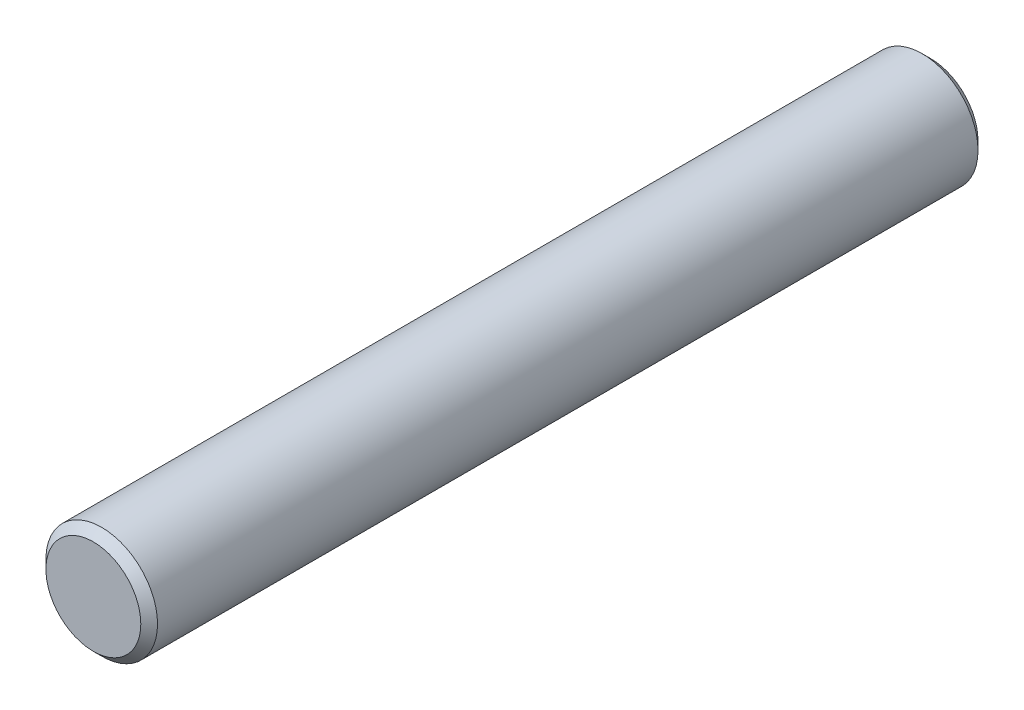
ISO-10303-21;
HEADER;
FILE_DESCRIPTION(('STEP AP214'),'2;1');
FILE_NAME('part.step','',(''),(''),'','','');
FILE_SCHEMA(('AUTOMOTIVE_DESIGN { 1 0 10303 214 1 1 1 1 }'));
ENDSEC;
DATA;
#1=APPLICATION_CONTEXT('core data for automotive mechanical design processes');
#2=APPLICATION_PROTOCOL_DEFINITION('international standard','automotive_design',2000,#1);
#3=PRODUCT_CONTEXT('',#1,'mechanical');
#4=PRODUCT('Part','Part','',(#3));
#5=PRODUCT_RELATED_PRODUCT_CATEGORY('part','',(#4));
#6=PRODUCT_DEFINITION_FORMATION('','',#4);
#7=PRODUCT_DEFINITION_CONTEXT('part definition',#1,'design');
#8=PRODUCT_DEFINITION('design','',#6,#7);
#9=PRODUCT_DEFINITION_SHAPE('','',#8);
#10=(LENGTH_UNIT() NAMED_UNIT(*) SI_UNIT(.MILLI.,.METRE.));
#11=(NAMED_UNIT(*) PLANE_ANGLE_UNIT() SI_UNIT($,.RADIAN.));
#12=(NAMED_UNIT(*) SI_UNIT($,.STERADIAN.) SOLID_ANGLE_UNIT());
#13=UNCERTAINTY_MEASURE_WITH_UNIT(LENGTH_MEASURE(1.E-05),#10,'distance_accuracy_value','');
#14=(GEOMETRIC_REPRESENTATION_CONTEXT(3) GLOBAL_UNCERTAINTY_ASSIGNED_CONTEXT((#13)) GLOBAL_UNIT_ASSIGNED_CONTEXT((#10,
#11,#12)) REPRESENTATION_CONTEXT('',''));
#15=CARTESIAN_POINT('',(0.,0.,0.));
#16=DIRECTION('',(0.,0.,1.));
#17=DIRECTION('',(1.,0.,0.));
#18=AXIS2_PLACEMENT_3D('',#15,#16,#17);
#19=CARTESIAN_POINT('',(0.,0.,30.));
#20=DIRECTION('',(0.,0.,-1.));
#21=DIRECTION('',(-1.,0.,0.));
#22=AXIS2_PLACEMENT_3D('',#19,#20,#21);
#23=CYLINDRICAL_SURFACE('',#22,2.);
#24=CARTESIAN_POINT('',(0.,0.,0.300000000000002));
#25=DIRECTION('',(0.,0.,1.));
#26=DIRECTION('',(1.,0.,0.));
#27=AXIS2_PLACEMENT_3D('',#24,#25,#26);
#28=CIRCLE('',#27,2.);
#29=CARTESIAN_POINT('',(2.,0.,0.300000000000002));
#30=VERTEX_POINT('',#29);
#31=EDGE_CURVE('E44',#30,#30,#28,.T.);
#32=ORIENTED_EDGE('',*,*,#31,.T.);
#33=EDGE_LOOP('',(#32));
#34=FACE_BOUND('',#33,.T.);
#35=CARTESIAN_POINT('',(0.,0.,29.7));
#36=DIRECTION('',(0.,0.,1.));
#37=DIRECTION('',(1.,0.,0.));
#38=AXIS2_PLACEMENT_3D('',#35,#36,#37);
#39=CIRCLE('',#38,2.);
#40=CARTESIAN_POINT('',(2.,0.,29.7));
#41=VERTEX_POINT('',#40);
#42=EDGE_CURVE('E48',#41,#41,#39,.F.);
#43=ORIENTED_EDGE('',*,*,#42,.T.);
#44=EDGE_LOOP('',(#43));
#45=FACE_BOUND('',#44,.T.);
#46=ADVANCED_FACE('F33',(#34,#45),#23,.T.);
#47=CARTESIAN_POINT('',(0.,0.,30.));
#48=DIRECTION('',(0.,0.,1.));
#49=DIRECTION('',(1.,0.,0.));
#50=AXIS2_PLACEMENT_3D('',#47,#48,#49);
#51=PLANE('',#50);
#52=CARTESIAN_POINT('',(0.,0.,30.));
#53=DIRECTION('',(0.,0.,1.));
#54=DIRECTION('',(1.,0.,0.));
#55=AXIS2_PLACEMENT_3D('',#52,#53,#54);
#56=CIRCLE('',#55,1.7);
#57=CARTESIAN_POINT('',(1.7,0.,30.));
#58=VERTEX_POINT('',#57);
#59=EDGE_CURVE('E10',#58,#58,#56,.T.);
#60=ORIENTED_EDGE('',*,*,#59,.T.);
#61=EDGE_LOOP('',(#60));
#62=FACE_BOUND('',#61,.T.);
#63=ADVANCED_FACE('F64',(#62),#51,.T.);
#64=CARTESIAN_POINT('',(0.,0.,0.));
#65=DIRECTION('',(0.,0.,1.));
#66=DIRECTION('',(1.,0.,0.));
#67=AXIS2_PLACEMENT_3D('',#64,#65,#66);
#68=PLANE('',#67);
#69=CARTESIAN_POINT('',(0.,0.,0.));
#70=DIRECTION('',(0.,0.,1.));
#71=DIRECTION('',(1.,0.,0.));
#72=AXIS2_PLACEMENT_3D('',#69,#70,#71);
#73=CIRCLE('',#72,1.69999999999999);
#74=CARTESIAN_POINT('',(1.69999999999999,0.,0.));
#75=VERTEX_POINT('',#74);
#76=EDGE_CURVE('E40',#75,#75,#73,.F.);
#77=ORIENTED_EDGE('',*,*,#76,.T.);
#78=EDGE_LOOP('',(#77));
#79=FACE_BOUND('',#78,.T.);
#80=ADVANCED_FACE('F61',(#79),#68,.F.);
#81=CARTESIAN_POINT('',(0.,0.,0.300000000000002));
#82=DIRECTION('',(0.,0.,1.));
#83=DIRECTION('',(1.,0.,0.));
#84=AXIS2_PLACEMENT_3D('',#81,#82,#83);
#85=CONICAL_SURFACE('',#84,2.,0.785398163397457);
#86=ORIENTED_EDGE('',*,*,#76,.F.);
#87=EDGE_LOOP('',(#86));
#88=FACE_BOUND('',#87,.T.);
#89=ORIENTED_EDGE('',*,*,#31,.F.);
#90=EDGE_LOOP('',(#89));
#91=FACE_BOUND('',#90,.T.);
#92=ADVANCED_FACE('F57',(#88,#91),#85,.T.);
#93=CARTESIAN_POINT('',(0.,0.,30.));
#94=DIRECTION('',(0.,0.,-1.));
#95=DIRECTION('',(-1.,0.,0.));
#96=AXIS2_PLACEMENT_3D('',#93,#94,#95);
#97=CONICAL_SURFACE('',#96,1.7,0.785398163397451);
#98=ORIENTED_EDGE('',*,*,#42,.F.);
#99=EDGE_LOOP('',(#98));
#100=FACE_BOUND('',#99,.T.);
#101=ORIENTED_EDGE('',*,*,#59,.F.);
#102=EDGE_LOOP('',(#101));
#103=FACE_BOUND('',#102,.T.);
#104=ADVANCED_FACE('F35',(#100,#103),#97,.T.);
#105=CLOSED_SHELL('',(#46,#63,#80,#92,#104));
#106=MANIFOLD_SOLID_BREP('B2',#105);
#107=ADVANCED_BREP_SHAPE_REPRESENTATION('',(#18,#106),#14);
#108=SHAPE_DEFINITION_REPRESENTATION(#9,#107);
ENDSEC;
END-ISO-10303-21;
